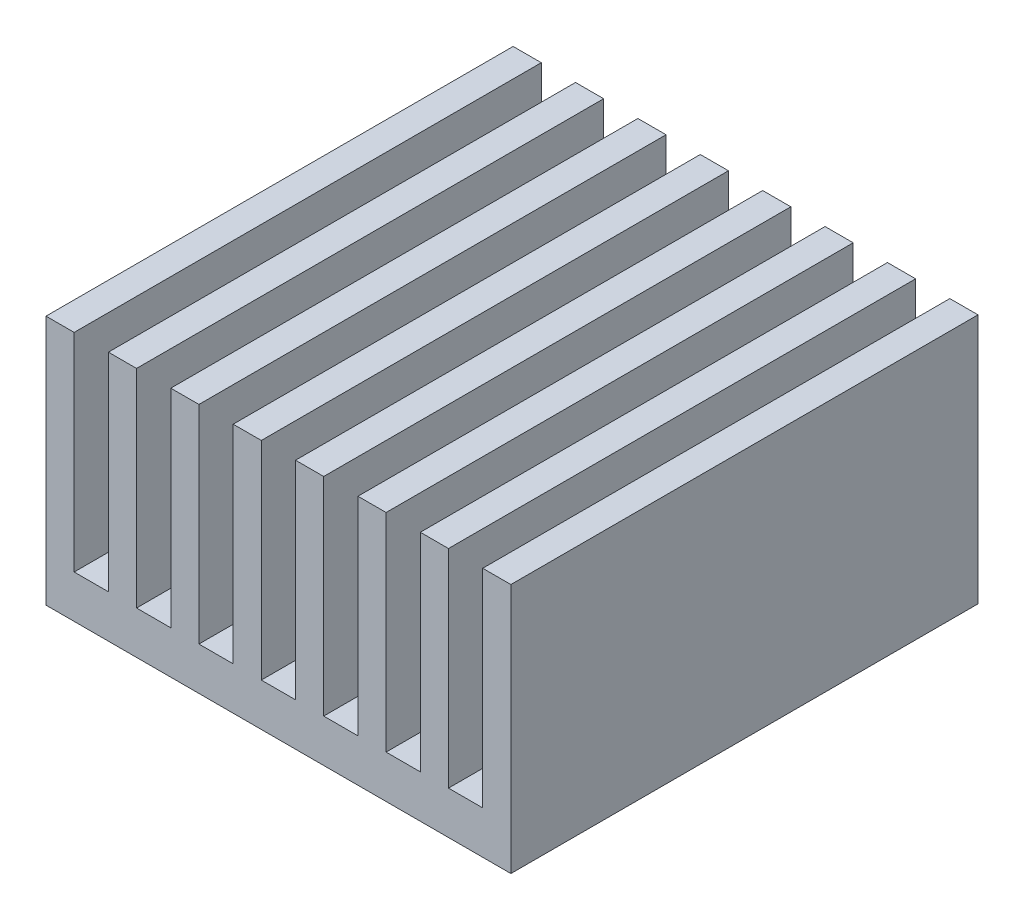
ISO-10303-21;
HEADER;
FILE_DESCRIPTION(('STEP AP214'),'2;1');
FILE_NAME('part.step','',(''),(''),'','','');
FILE_SCHEMA(('AUTOMOTIVE_DESIGN { 1 0 10303 214 1 1 1 1 }'));
ENDSEC;
DATA;
#1=APPLICATION_CONTEXT('core data for automotive mechanical design processes');
#2=APPLICATION_PROTOCOL_DEFINITION('international standard','automotive_design',2000,#1);
#3=PRODUCT_CONTEXT('',#1,'mechanical');
#4=PRODUCT('Part','Part','',(#3));
#5=PRODUCT_RELATED_PRODUCT_CATEGORY('part','',(#4));
#6=PRODUCT_DEFINITION_FORMATION('','',#4);
#7=PRODUCT_DEFINITION_CONTEXT('part definition',#1,'design');
#8=PRODUCT_DEFINITION('design','',#6,#7);
#9=PRODUCT_DEFINITION_SHAPE('','',#8);
#10=(LENGTH_UNIT() NAMED_UNIT(*) SI_UNIT(.MILLI.,.METRE.));
#11=(NAMED_UNIT(*) PLANE_ANGLE_UNIT() SI_UNIT($,.RADIAN.));
#12=(NAMED_UNIT(*) SI_UNIT($,.STERADIAN.) SOLID_ANGLE_UNIT());
#13=UNCERTAINTY_MEASURE_WITH_UNIT(LENGTH_MEASURE(1.E-05),#10,'distance_accuracy_value','');
#14=(GEOMETRIC_REPRESENTATION_CONTEXT(3) GLOBAL_UNCERTAINTY_ASSIGNED_CONTEXT((#13)) GLOBAL_UNIT_ASSIGNED_CONTEXT((#10,
#11,#12)) REPRESENTATION_CONTEXT('',''));
#15=CARTESIAN_POINT('',(0.,0.,0.));
#16=DIRECTION('',(0.,0.,1.));
#17=DIRECTION('',(1.,0.,0.));
#18=AXIS2_PLACEMENT_3D('',#15,#16,#17);
#19=CARTESIAN_POINT('',(0.,1.52,0.));
#20=DIRECTION('',(0.,-1.,0.));
#21=DIRECTION('',(0.,0.,-1.));
#22=AXIS2_PLACEMENT_3D('',#19,#20,#21);
#23=PLANE('',#22);
#24=DIRECTION('',(0.,0.,1.));
#25=VECTOR('',#24,1.);
#26=CARTESIAN_POINT('',(15.51,1.52,-16.59));
#27=LINE('',#26,#25);
#28=CARTESIAN_POINT('',(15.51,1.52,-16.59));
#29=VERTEX_POINT('',#28);
#30=CARTESIAN_POINT('',(15.51,1.52,0.));
#31=VERTEX_POINT('',#30);
#32=EDGE_CURVE('E267',#29,#31,#27,.T.);
#33=ORIENTED_EDGE('',*,*,#32,.F.);
#34=DIRECTION('',(-1.,0.,0.));
#35=VECTOR('',#34,1.);
#36=CARTESIAN_POINT('',(0.,1.52,-16.59));
#37=LINE('',#36,#35);
#38=CARTESIAN_POINT('',(14.2942857142857,1.52,-16.59));
#39=VERTEX_POINT('',#38);
#40=EDGE_CURVE('E271',#29,#39,#37,.T.);
#41=ORIENTED_EDGE('',*,*,#40,.T.);
#42=DIRECTION('',(0.,0.,-1.));
#43=VECTOR('',#42,1.);
#44=CARTESIAN_POINT('',(14.2942857142857,1.52,-16.59));
#45=LINE('',#44,#43);
#46=CARTESIAN_POINT('',(14.2942857142857,1.52,0.));
#47=VERTEX_POINT('',#46);
#48=EDGE_CURVE('E59',#47,#39,#45,.T.);
#49=ORIENTED_EDGE('',*,*,#48,.F.);
#50=DIRECTION('',(1.,0.,0.));
#51=VECTOR('',#50,1.);
#52=CARTESIAN_POINT('',(0.,1.52,0.));
#53=LINE('',#52,#51);
#54=EDGE_CURVE('E54',#47,#31,#53,.T.);
#55=ORIENTED_EDGE('',*,*,#54,.T.);
#56=EDGE_LOOP('',(#33,#41,#49,#55));
#57=FACE_BOUND('',#56,.T.);
#58=ADVANCED_FACE('F39',(#57),#23,.F.);
#59=DIRECTION('',(0.,0.,1.));
#60=VECTOR('',#59,1.);
#61=CARTESIAN_POINT('',(13.2942857142857,1.52,-16.59));
#62=LINE('',#61,#60);
#63=CARTESIAN_POINT('',(13.2942857142857,1.52,-16.59));
#64=VERTEX_POINT('',#63);
#65=CARTESIAN_POINT('',(13.2942857142857,1.52,0.));
#66=VERTEX_POINT('',#65);
#67=EDGE_CURVE('E272',#64,#66,#62,.T.);
#68=ORIENTED_EDGE('',*,*,#67,.F.);
#69=CARTESIAN_POINT('',(12.0785714285714,1.52,-16.59));
#70=VERTEX_POINT('',#69);
#71=EDGE_CURVE('E461',#64,#70,#37,.T.);
#72=ORIENTED_EDGE('',*,*,#71,.T.);
#73=DIRECTION('',(0.,0.,-1.));
#74=VECTOR('',#73,1.);
#75=CARTESIAN_POINT('',(12.0785714285714,1.52,-16.59));
#76=LINE('',#75,#74);
#77=CARTESIAN_POINT('',(12.0785714285714,1.52,0.));
#78=VERTEX_POINT('',#77);
#79=EDGE_CURVE('E305',#78,#70,#76,.T.);
#80=ORIENTED_EDGE('',*,*,#79,.F.);
#81=EDGE_CURVE('E527',#78,#66,#53,.T.);
#82=ORIENTED_EDGE('',*,*,#81,.T.);
#83=EDGE_LOOP('',(#68,#72,#80,#82));
#84=FACE_BOUND('',#83,.T.);
#85=ADVANCED_FACE('F534',(#84),#23,.F.);
#86=DIRECTION('',(0.,0.,1.));
#87=VECTOR('',#86,1.);
#88=CARTESIAN_POINT('',(11.0785714285714,1.52,-16.59));
#89=LINE('',#88,#87);
#90=CARTESIAN_POINT('',(11.0785714285714,1.52,-16.59));
#91=VERTEX_POINT('',#90);
#92=CARTESIAN_POINT('',(11.0785714285714,1.52,0.));
#93=VERTEX_POINT('',#92);
#94=EDGE_CURVE('E300',#91,#93,#89,.T.);
#95=ORIENTED_EDGE('',*,*,#94,.F.);
#96=CARTESIAN_POINT('',(9.86285714285715,1.52,-16.59));
#97=VERTEX_POINT('',#96);
#98=EDGE_CURVE('E549',#91,#97,#37,.T.);
#99=ORIENTED_EDGE('',*,*,#98,.T.);
#100=DIRECTION('',(0.,0.,-1.));
#101=VECTOR('',#100,1.);
#102=CARTESIAN_POINT('',(9.86285714285714,1.52,-16.59));
#103=LINE('',#102,#101);
#104=CARTESIAN_POINT('',(9.86285714285715,1.52,0.));
#105=VERTEX_POINT('',#104);
#106=EDGE_CURVE('E332',#105,#97,#103,.T.);
#107=ORIENTED_EDGE('',*,*,#106,.F.);
#108=EDGE_CURVE('E523',#105,#93,#53,.T.);
#109=ORIENTED_EDGE('',*,*,#108,.T.);
#110=EDGE_LOOP('',(#95,#99,#107,#109));
#111=FACE_BOUND('',#110,.T.);
#112=ADVANCED_FACE('F589',(#111),#23,.F.);
#113=DIRECTION('',(0.,0.,1.));
#114=VECTOR('',#113,1.);
#115=CARTESIAN_POINT('',(8.86285714285714,1.52,-16.59));
#116=LINE('',#115,#114);
#117=CARTESIAN_POINT('',(8.86285714285714,1.52,-16.59));
#118=VERTEX_POINT('',#117);
#119=CARTESIAN_POINT('',(8.86285714285714,1.52,0.));
#120=VERTEX_POINT('',#119);
#121=EDGE_CURVE('E327',#118,#120,#116,.T.);
#122=ORIENTED_EDGE('',*,*,#121,.F.);
#123=CARTESIAN_POINT('',(7.64714285714286,1.52,-16.59));
#124=VERTEX_POINT('',#123);
#125=EDGE_CURVE('E550',#118,#124,#37,.T.);
#126=ORIENTED_EDGE('',*,*,#125,.T.);
#127=DIRECTION('',(0.,0.,-1.));
#128=VECTOR('',#127,1.);
#129=CARTESIAN_POINT('',(7.64714285714286,1.52,-16.59));
#130=LINE('',#129,#128);
#131=CARTESIAN_POINT('',(7.64714285714286,1.52,0.));
#132=VERTEX_POINT('',#131);
#133=EDGE_CURVE('E359',#132,#124,#130,.T.);
#134=ORIENTED_EDGE('',*,*,#133,.F.);
#135=EDGE_CURVE('E519',#132,#120,#53,.T.);
#136=ORIENTED_EDGE('',*,*,#135,.T.);
#137=EDGE_LOOP('',(#122,#126,#134,#136));
#138=FACE_BOUND('',#137,.T.);
#139=ADVANCED_FACE('F575',(#138),#23,.F.);
#140=DIRECTION('',(0.,0.,1.));
#141=VECTOR('',#140,1.);
#142=CARTESIAN_POINT('',(6.64714285714286,1.52,-16.59));
#143=LINE('',#142,#141);
#144=CARTESIAN_POINT('',(6.64714285714286,1.52,-16.59));
#145=VERTEX_POINT('',#144);
#146=CARTESIAN_POINT('',(6.64714285714286,1.52,0.));
#147=VERTEX_POINT('',#146);
#148=EDGE_CURVE('E354',#145,#147,#143,.T.);
#149=ORIENTED_EDGE('',*,*,#148,.F.);
#150=CARTESIAN_POINT('',(5.43142857142857,1.52,-16.59));
#151=VERTEX_POINT('',#150);
#152=EDGE_CURVE('E551',#145,#151,#37,.T.);
#153=ORIENTED_EDGE('',*,*,#152,.T.);
#154=DIRECTION('',(0.,0.,-1.));
#155=VECTOR('',#154,1.);
#156=CARTESIAN_POINT('',(5.43142857142857,1.52,-16.59));
#157=LINE('',#156,#155);
#158=CARTESIAN_POINT('',(5.43142857142857,1.52,0.));
#159=VERTEX_POINT('',#158);
#160=EDGE_CURVE('E386',#159,#151,#157,.T.);
#161=ORIENTED_EDGE('',*,*,#160,.F.);
#162=EDGE_CURVE('E518',#159,#147,#53,.T.);
#163=ORIENTED_EDGE('',*,*,#162,.T.);
#164=EDGE_LOOP('',(#149,#153,#161,#163));
#165=FACE_BOUND('',#164,.T.);
#166=ADVANCED_FACE('F552',(#165),#23,.F.);
#167=DIRECTION('',(0.,0.,1.));
#168=VECTOR('',#167,1.);
#169=CARTESIAN_POINT('',(4.43142857142857,1.52,-16.59));
#170=LINE('',#169,#168);
#171=CARTESIAN_POINT('',(4.43142857142857,1.52,-16.59));
#172=VERTEX_POINT('',#171);
#173=CARTESIAN_POINT('',(4.43142857142857,1.52,0.));
#174=VERTEX_POINT('',#173);
#175=EDGE_CURVE('E381',#172,#174,#170,.T.);
#176=ORIENTED_EDGE('',*,*,#175,.F.);
#177=CARTESIAN_POINT('',(3.21571428571429,1.52,-16.59));
#178=VERTEX_POINT('',#177);
#179=EDGE_CURVE('E515',#172,#178,#37,.T.);
#180=ORIENTED_EDGE('',*,*,#179,.T.);
#181=DIRECTION('',(0.,0.,-1.));
#182=VECTOR('',#181,1.);
#183=CARTESIAN_POINT('',(3.21571428571429,1.52,-16.59));
#184=LINE('',#183,#182);
#185=CARTESIAN_POINT('',(3.21571428571429,1.52,0.));
#186=VERTEX_POINT('',#185);
#187=EDGE_CURVE('E413',#186,#178,#184,.T.);
#188=ORIENTED_EDGE('',*,*,#187,.F.);
#189=EDGE_CURVE('E458',#186,#174,#53,.T.);
#190=ORIENTED_EDGE('',*,*,#189,.T.);
#191=EDGE_LOOP('',(#176,#180,#188,#190));
#192=FACE_BOUND('',#191,.T.);
#193=ADVANCED_FACE('F514',(#192),#23,.F.);
#194=DIRECTION('',(0.,0.,1.));
#195=VECTOR('',#194,1.);
#196=CARTESIAN_POINT('',(2.21571428571428,1.52,-16.59));
#197=LINE('',#196,#195);
#198=CARTESIAN_POINT('',(2.21571428571428,1.52,-16.59));
#199=VERTEX_POINT('',#198);
#200=CARTESIAN_POINT('',(2.21571428571428,1.52,0.));
#201=VERTEX_POINT('',#200);
#202=EDGE_CURVE('E408',#199,#201,#197,.T.);
#203=ORIENTED_EDGE('',*,*,#202,.F.);
#204=CARTESIAN_POINT('',(1.,1.52,-16.59));
#205=VERTEX_POINT('',#204);
#206=EDGE_CURVE('E457',#199,#205,#37,.T.);
#207=ORIENTED_EDGE('',*,*,#206,.T.);
#208=DIRECTION('',(0.,0.,-1.));
#209=VECTOR('',#208,1.);
#210=CARTESIAN_POINT('',(1.,1.52,-16.59));
#211=LINE('',#210,#209);
#212=CARTESIAN_POINT('',(1.,1.52,0.));
#213=VERTEX_POINT('',#212);
#214=EDGE_CURVE('E435',#213,#205,#211,.T.);
#215=ORIENTED_EDGE('',*,*,#214,.F.);
#216=EDGE_CURVE('E455',#213,#201,#53,.T.);
#217=ORIENTED_EDGE('',*,*,#216,.T.);
#218=EDGE_LOOP('',(#203,#207,#215,#217));
#219=FACE_BOUND('',#218,.T.);
#220=ADVANCED_FACE('F497',(#219),#23,.F.);
#221=CARTESIAN_POINT('',(0.,1.52,0.));
#222=DIRECTION('',(1.,0.,0.));
#223=DIRECTION('',(0.,0.,-1.));
#224=AXIS2_PLACEMENT_3D('',#221,#222,#223);
#225=PLANE('',#224);
#226=DIRECTION('',(0.,0.,1.));
#227=VECTOR('',#226,1.);
#228=CARTESIAN_POINT('',(0.,0.,0.));
#229=LINE('',#228,#227);
#230=CARTESIAN_POINT('',(0.,0.,-16.59));
#231=VERTEX_POINT('',#230);
#232=CARTESIAN_POINT('',(0.,0.,0.));
#233=VERTEX_POINT('',#232);
#234=EDGE_CURVE('E454',#231,#233,#229,.T.);
#235=ORIENTED_EDGE('',*,*,#234,.T.);
#236=DIRECTION('',(0.,-1.,0.));
#237=VECTOR('',#236,1.);
#238=CARTESIAN_POINT('',(0.,1.52,0.));
#239=LINE('',#238,#237);
#240=CARTESIAN_POINT('',(0.,8.89,0.));
#241=VERTEX_POINT('',#240);
#242=EDGE_CURVE('E11',#241,#233,#239,.T.);
#243=ORIENTED_EDGE('',*,*,#242,.F.);
#244=DIRECTION('',(0.,0.,1.));
#245=VECTOR('',#244,1.);
#246=CARTESIAN_POINT('',(0.,8.89,-16.59));
#247=LINE('',#246,#245);
#248=CARTESIAN_POINT('',(0.,8.89,-16.59));
#249=VERTEX_POINT('',#248);
#250=EDGE_CURVE('E436',#249,#241,#247,.T.);
#251=ORIENTED_EDGE('',*,*,#250,.F.);
#252=DIRECTION('',(0.,-1.,0.));
#253=VECTOR('',#252,1.);
#254=CARTESIAN_POINT('',(0.,1.52,-16.59));
#255=LINE('',#254,#253);
#256=EDGE_CURVE('E460',#249,#231,#255,.T.);
#257=ORIENTED_EDGE('',*,*,#256,.T.);
#258=EDGE_LOOP('',(#235,#243,#251,#257));
#259=FACE_BOUND('',#258,.T.);
#260=ADVANCED_FACE('F41',(#259),#225,.F.);
#261=CARTESIAN_POINT('',(0.,1.52,0.));
#262=DIRECTION('',(0.,0.,-1.));
#263=DIRECTION('',(-1.,0.,0.));
#264=AXIS2_PLACEMENT_3D('',#261,#262,#263);
#265=PLANE('',#264);
#266=DIRECTION('',(1.,0.,0.));
#267=VECTOR('',#266,1.);
#268=CARTESIAN_POINT('',(0.,0.,0.));
#269=LINE('',#268,#267);
#270=CARTESIAN_POINT('',(16.51,0.,0.));
#271=VERTEX_POINT('',#270);
#272=EDGE_CURVE('E464',#233,#271,#269,.T.);
#273=ORIENTED_EDGE('',*,*,#272,.T.);
#274=DIRECTION('',(0.,-1.,0.));
#275=VECTOR('',#274,1.);
#276=CARTESIAN_POINT('',(16.51,1.52,0.));
#277=LINE('',#276,#275);
#278=CARTESIAN_POINT('',(16.51,8.89,0.));
#279=VERTEX_POINT('',#278);
#280=EDGE_CURVE('E47',#279,#271,#277,.T.);
#281=ORIENTED_EDGE('',*,*,#280,.F.);
#282=DIRECTION('',(1.,0.,0.));
#283=VECTOR('',#282,1.);
#284=CARTESIAN_POINT('',(15.51,8.89,0.));
#285=LINE('',#284,#283);
#286=CARTESIAN_POINT('',(15.51,8.89,0.));
#287=VERTEX_POINT('',#286);
#288=EDGE_CURVE('E257',#287,#279,#285,.T.);
#289=ORIENTED_EDGE('',*,*,#288,.F.);
#290=DIRECTION('',(0.,-1.,0.));
#291=VECTOR('',#290,1.);
#292=CARTESIAN_POINT('',(15.51,8.89,0.));
#293=LINE('',#292,#291);
#294=EDGE_CURVE('E253',#287,#31,#293,.T.);
#295=ORIENTED_EDGE('',*,*,#294,.T.);
#296=ORIENTED_EDGE('',*,*,#54,.F.);
#297=DIRECTION('',(0.,-1.,0.));
#298=VECTOR('',#297,1.);
#299=CARTESIAN_POINT('',(14.2942857142857,8.89,0.));
#300=LINE('',#299,#298);
#301=CARTESIAN_POINT('',(14.2942857142857,8.89,0.));
#302=VERTEX_POINT('',#301);
#303=EDGE_CURVE('E291',#302,#47,#300,.T.);
#304=ORIENTED_EDGE('',*,*,#303,.F.);
#305=DIRECTION('',(1.,0.,0.));
#306=VECTOR('',#305,1.);
#307=CARTESIAN_POINT('',(13.2942857142857,8.89,0.));
#308=LINE('',#307,#306);
#309=CARTESIAN_POINT('',(13.2942857142857,8.89,0.));
#310=VERTEX_POINT('',#309);
#311=EDGE_CURVE('E284',#310,#302,#308,.T.);
#312=ORIENTED_EDGE('',*,*,#311,.F.);
#313=DIRECTION('',(0.,-1.,0.));
#314=VECTOR('',#313,1.);
#315=CARTESIAN_POINT('',(13.2942857142857,8.89,0.));
#316=LINE('',#315,#314);
#317=EDGE_CURVE('E294',#310,#66,#316,.T.);
#318=ORIENTED_EDGE('',*,*,#317,.T.);
#319=ORIENTED_EDGE('',*,*,#81,.F.);
#320=DIRECTION('',(0.,-1.,0.));
#321=VECTOR('',#320,1.);
#322=CARTESIAN_POINT('',(12.0785714285714,8.89,0.));
#323=LINE('',#322,#321);
#324=CARTESIAN_POINT('',(12.0785714285714,8.89,0.));
#325=VERTEX_POINT('',#324);
#326=EDGE_CURVE('E318',#325,#78,#323,.T.);
#327=ORIENTED_EDGE('',*,*,#326,.F.);
#328=DIRECTION('',(1.,0.,0.));
#329=VECTOR('',#328,1.);
#330=CARTESIAN_POINT('',(11.0785714285714,8.89,0.));
#331=LINE('',#330,#329);
#332=CARTESIAN_POINT('',(11.0785714285714,8.89,0.));
#333=VERTEX_POINT('',#332);
#334=EDGE_CURVE('E307',#333,#325,#331,.T.);
#335=ORIENTED_EDGE('',*,*,#334,.F.);
#336=DIRECTION('',(0.,-1.,0.));
#337=VECTOR('',#336,1.);
#338=CARTESIAN_POINT('',(11.0785714285714,8.89,0.));
#339=LINE('',#338,#337);
#340=EDGE_CURVE('E321',#333,#93,#339,.T.);
#341=ORIENTED_EDGE('',*,*,#340,.T.);
#342=ORIENTED_EDGE('',*,*,#108,.F.);
#343=DIRECTION('',(0.,-1.,0.));
#344=VECTOR('',#343,1.);
#345=CARTESIAN_POINT('',(9.86285714285715,8.89,0.));
#346=LINE('',#345,#344);
#347=CARTESIAN_POINT('',(9.86285714285715,8.89,0.));
#348=VERTEX_POINT('',#347);
#349=EDGE_CURVE('E345',#348,#105,#346,.T.);
#350=ORIENTED_EDGE('',*,*,#349,.F.);
#351=DIRECTION('',(1.,0.,0.));
#352=VECTOR('',#351,1.);
#353=CARTESIAN_POINT('',(8.86285714285715,8.89,0.));
#354=LINE('',#353,#352);
#355=CARTESIAN_POINT('',(8.86285714285715,8.89,0.));
#356=VERTEX_POINT('',#355);
#357=EDGE_CURVE('E334',#356,#348,#354,.T.);
#358=ORIENTED_EDGE('',*,*,#357,.F.);
#359=DIRECTION('',(0.,-1.,0.));
#360=VECTOR('',#359,1.);
#361=CARTESIAN_POINT('',(8.86285714285715,8.89,0.));
#362=LINE('',#361,#360);
#363=EDGE_CURVE('E348',#356,#120,#362,.T.);
#364=ORIENTED_EDGE('',*,*,#363,.T.);
#365=ORIENTED_EDGE('',*,*,#135,.F.);
#366=DIRECTION('',(0.,-1.,0.));
#367=VECTOR('',#366,1.);
#368=CARTESIAN_POINT('',(7.64714285714286,8.89,0.));
#369=LINE('',#368,#367);
#370=CARTESIAN_POINT('',(7.64714285714286,8.89,0.));
#371=VERTEX_POINT('',#370);
#372=EDGE_CURVE('E372',#371,#132,#369,.T.);
#373=ORIENTED_EDGE('',*,*,#372,.F.);
#374=DIRECTION('',(1.,0.,0.));
#375=VECTOR('',#374,1.);
#376=CARTESIAN_POINT('',(6.64714285714286,8.89,0.));
#377=LINE('',#376,#375);
#378=CARTESIAN_POINT('',(6.64714285714286,8.89,0.));
#379=VERTEX_POINT('',#378);
#380=EDGE_CURVE('E361',#379,#371,#377,.T.);
#381=ORIENTED_EDGE('',*,*,#380,.F.);
#382=DIRECTION('',(0.,-1.,0.));
#383=VECTOR('',#382,1.);
#384=CARTESIAN_POINT('',(6.64714285714286,8.89,0.));
#385=LINE('',#384,#383);
#386=EDGE_CURVE('E375',#379,#147,#385,.T.);
#387=ORIENTED_EDGE('',*,*,#386,.T.);
#388=ORIENTED_EDGE('',*,*,#162,.F.);
#389=DIRECTION('',(0.,-1.,0.));
#390=VECTOR('',#389,1.);
#391=CARTESIAN_POINT('',(5.43142857142857,8.89,0.));
#392=LINE('',#391,#390);
#393=CARTESIAN_POINT('',(5.43142857142857,8.89,0.));
#394=VERTEX_POINT('',#393);
#395=EDGE_CURVE('E399',#394,#159,#392,.T.);
#396=ORIENTED_EDGE('',*,*,#395,.F.);
#397=DIRECTION('',(1.,0.,0.));
#398=VECTOR('',#397,1.);
#399=CARTESIAN_POINT('',(4.43142857142857,8.89,0.));
#400=LINE('',#399,#398);
#401=CARTESIAN_POINT('',(4.43142857142857,8.89,0.));
#402=VERTEX_POINT('',#401);
#403=EDGE_CURVE('E388',#402,#394,#400,.T.);
#404=ORIENTED_EDGE('',*,*,#403,.F.);
#405=DIRECTION('',(0.,-1.,0.));
#406=VECTOR('',#405,1.);
#407=CARTESIAN_POINT('',(4.43142857142857,8.89,0.));
#408=LINE('',#407,#406);
#409=EDGE_CURVE('E402',#402,#174,#408,.T.);
#410=ORIENTED_EDGE('',*,*,#409,.T.);
#411=ORIENTED_EDGE('',*,*,#189,.F.);
#412=DIRECTION('',(0.,-1.,0.));
#413=VECTOR('',#412,1.);
#414=CARTESIAN_POINT('',(3.21571428571429,8.89,0.));
#415=LINE('',#414,#413);
#416=CARTESIAN_POINT('',(3.21571428571429,8.89,0.));
#417=VERTEX_POINT('',#416);
#418=EDGE_CURVE('E426',#417,#186,#415,.T.);
#419=ORIENTED_EDGE('',*,*,#418,.F.);
#420=DIRECTION('',(1.,0.,0.));
#421=VECTOR('',#420,1.);
#422=CARTESIAN_POINT('',(2.21571428571429,8.89,0.));
#423=LINE('',#422,#421);
#424=CARTESIAN_POINT('',(2.21571428571429,8.89,0.));
#425=VERTEX_POINT('',#424);
#426=EDGE_CURVE('E415',#425,#417,#423,.T.);
#427=ORIENTED_EDGE('',*,*,#426,.F.);
#428=DIRECTION('',(0.,-1.,0.));
#429=VECTOR('',#428,1.);
#430=CARTESIAN_POINT('',(2.21571428571429,8.89,0.));
#431=LINE('',#430,#429);
#432=EDGE_CURVE('E429',#425,#201,#431,.T.);
#433=ORIENTED_EDGE('',*,*,#432,.T.);
#434=ORIENTED_EDGE('',*,*,#216,.F.);
#435=DIRECTION('',(0.,-1.,0.));
#436=VECTOR('',#435,1.);
#437=CARTESIAN_POINT('',(1.,8.89,0.));
#438=LINE('',#437,#436);
#439=CARTESIAN_POINT('',(1.,8.89,0.));
#440=VERTEX_POINT('',#439);
#441=EDGE_CURVE('E451',#440,#213,#438,.T.);
#442=ORIENTED_EDGE('',*,*,#441,.F.);
#443=DIRECTION('',(1.,0.,0.));
#444=VECTOR('',#443,1.);
#445=CARTESIAN_POINT('',(0.,8.89,0.));
#446=LINE('',#445,#444);
#447=EDGE_CURVE('E439',#241,#440,#446,.T.);
#448=ORIENTED_EDGE('',*,*,#447,.F.);
#449=ORIENTED_EDGE('',*,*,#242,.T.);
#450=EDGE_LOOP('',(#273,#281,#289,#295,#296,#304,#312,#318,#319,#327,#335,#341,#342,#350,#358,
#364,#365,#373,#381,#387,#388,#396,#404,#410,#411,#419,#427,#433,#434,#442,#448,#449));
#451=FACE_BOUND('',#450,.T.);
#452=ADVANCED_FACE('F498',(#451),#265,.F.);
#453=CARTESIAN_POINT('',(16.51,1.52,0.));
#454=DIRECTION('',(-1.,0.,0.));
#455=DIRECTION('',(0.,0.,1.));
#456=AXIS2_PLACEMENT_3D('',#453,#454,#455);
#457=PLANE('',#456);
#458=DIRECTION('',(0.,0.,-1.));
#459=VECTOR('',#458,1.);
#460=CARTESIAN_POINT('',(16.51,0.,0.));
#461=LINE('',#460,#459);
#462=CARTESIAN_POINT('',(16.51,0.,-16.59));
#463=VERTEX_POINT('',#462);
#464=EDGE_CURVE('E466',#271,#463,#461,.T.);
#465=ORIENTED_EDGE('',*,*,#464,.T.);
#466=DIRECTION('',(0.,-1.,0.));
#467=VECTOR('',#466,1.);
#468=CARTESIAN_POINT('',(16.51,1.52,-16.59));
#469=LINE('',#468,#467);
#470=CARTESIAN_POINT('',(16.51,8.89,-16.59));
#471=VERTEX_POINT('',#470);
#472=EDGE_CURVE('E472',#471,#463,#469,.T.);
#473=ORIENTED_EDGE('',*,*,#472,.F.);
#474=DIRECTION('',(0.,0.,-1.));
#475=VECTOR('',#474,1.);
#476=CARTESIAN_POINT('',(16.51,8.89,-16.59));
#477=LINE('',#476,#475);
#478=EDGE_CURVE('E264',#279,#471,#477,.T.);
#479=ORIENTED_EDGE('',*,*,#478,.F.);
#480=ORIENTED_EDGE('',*,*,#280,.T.);
#481=EDGE_LOOP('',(#465,#473,#479,#480));
#482=FACE_BOUND('',#481,.T.);
#483=ADVANCED_FACE('F476',(#482),#457,.F.);
#484=CARTESIAN_POINT('',(0.,1.52,-16.59));
#485=DIRECTION('',(0.,0.,1.));
#486=DIRECTION('',(1.,0.,0.));
#487=AXIS2_PLACEMENT_3D('',#484,#485,#486);
#488=PLANE('',#487);
#489=DIRECTION('',(-1.,0.,0.));
#490=VECTOR('',#489,1.);
#491=CARTESIAN_POINT('',(0.,0.,-16.59));
#492=LINE('',#491,#490);
#493=EDGE_CURVE('E468',#463,#231,#492,.T.);
#494=ORIENTED_EDGE('',*,*,#493,.T.);
#495=ORIENTED_EDGE('',*,*,#256,.F.);
#496=DIRECTION('',(-1.,0.,0.));
#497=VECTOR('',#496,1.);
#498=CARTESIAN_POINT('',(0.,8.89,-16.59));
#499=LINE('',#498,#497);
#500=CARTESIAN_POINT('',(1.,8.89,-16.59));
#501=VERTEX_POINT('',#500);
#502=EDGE_CURVE('E443',#501,#249,#499,.T.);
#503=ORIENTED_EDGE('',*,*,#502,.F.);
#504=DIRECTION('',(0.,-1.,0.));
#505=VECTOR('',#504,1.);
#506=CARTESIAN_POINT('',(1.,8.89,-16.59));
#507=LINE('',#506,#505);
#508=EDGE_CURVE('E446',#501,#205,#507,.T.);
#509=ORIENTED_EDGE('',*,*,#508,.T.);
#510=ORIENTED_EDGE('',*,*,#206,.F.);
#511=DIRECTION('',(0.,-1.,0.));
#512=VECTOR('',#511,1.);
#513=CARTESIAN_POINT('',(2.21571428571428,8.89,-16.59));
#514=LINE('',#513,#512);
#515=CARTESIAN_POINT('',(2.21571428571428,8.89,-16.59));
#516=VERTEX_POINT('',#515);
#517=EDGE_CURVE('E432',#516,#199,#514,.T.);
#518=ORIENTED_EDGE('',*,*,#517,.F.);
#519=DIRECTION('',(-1.,0.,0.));
#520=VECTOR('',#519,1.);
#521=CARTESIAN_POINT('',(2.21571428571428,8.89,-16.59));
#522=LINE('',#521,#520);
#523=CARTESIAN_POINT('',(3.21571428571429,8.89,-16.59));
#524=VERTEX_POINT('',#523);
#525=EDGE_CURVE('E409',#524,#516,#522,.T.);
#526=ORIENTED_EDGE('',*,*,#525,.F.);
#527=DIRECTION('',(0.,-1.,0.));
#528=VECTOR('',#527,1.);
#529=CARTESIAN_POINT('',(3.21571428571429,8.89,-16.59));
#530=LINE('',#529,#528);
#531=EDGE_CURVE('E419',#524,#178,#530,.T.);
#532=ORIENTED_EDGE('',*,*,#531,.T.);
#533=ORIENTED_EDGE('',*,*,#179,.F.);
#534=DIRECTION('',(0.,-1.,0.));
#535=VECTOR('',#534,1.);
#536=CARTESIAN_POINT('',(4.43142857142857,8.89,-16.59));
#537=LINE('',#536,#535);
#538=CARTESIAN_POINT('',(4.43142857142857,8.89,-16.59));
#539=VERTEX_POINT('',#538);
#540=EDGE_CURVE('E405',#539,#172,#537,.T.);
#541=ORIENTED_EDGE('',*,*,#540,.F.);
#542=DIRECTION('',(-1.,0.,0.));
#543=VECTOR('',#542,1.);
#544=CARTESIAN_POINT('',(4.43142857142857,8.89,-16.59));
#545=LINE('',#544,#543);
#546=CARTESIAN_POINT('',(5.43142857142857,8.89,-16.59));
#547=VERTEX_POINT('',#546);
#548=EDGE_CURVE('E382',#547,#539,#545,.T.);
#549=ORIENTED_EDGE('',*,*,#548,.F.);
#550=DIRECTION('',(0.,-1.,0.));
#551=VECTOR('',#550,1.);
#552=CARTESIAN_POINT('',(5.43142857142857,8.89,-16.59));
#553=LINE('',#552,#551);
#554=EDGE_CURVE('E392',#547,#151,#553,.T.);
#555=ORIENTED_EDGE('',*,*,#554,.T.);
#556=ORIENTED_EDGE('',*,*,#152,.F.);
#557=DIRECTION('',(0.,-1.,0.));
#558=VECTOR('',#557,1.);
#559=CARTESIAN_POINT('',(6.64714285714286,8.89,-16.59));
#560=LINE('',#559,#558);
#561=CARTESIAN_POINT('',(6.64714285714286,8.89,-16.59));
#562=VERTEX_POINT('',#561);
#563=EDGE_CURVE('E378',#562,#145,#560,.T.);
#564=ORIENTED_EDGE('',*,*,#563,.F.);
#565=DIRECTION('',(-1.,0.,0.));
#566=VECTOR('',#565,1.);
#567=CARTESIAN_POINT('',(6.64714285714286,8.89,-16.59));
#568=LINE('',#567,#566);
#569=CARTESIAN_POINT('',(7.64714285714286,8.89,-16.59));
#570=VERTEX_POINT('',#569);
#571=EDGE_CURVE('E355',#570,#562,#568,.T.);
#572=ORIENTED_EDGE('',*,*,#571,.F.);
#573=DIRECTION('',(0.,-1.,0.));
#574=VECTOR('',#573,1.);
#575=CARTESIAN_POINT('',(7.64714285714286,8.89,-16.59));
#576=LINE('',#575,#574);
#577=EDGE_CURVE('E365',#570,#124,#576,.T.);
#578=ORIENTED_EDGE('',*,*,#577,.T.);
#579=ORIENTED_EDGE('',*,*,#125,.F.);
#580=DIRECTION('',(0.,-1.,0.));
#581=VECTOR('',#580,1.);
#582=CARTESIAN_POINT('',(8.86285714285714,8.89,-16.59));
#583=LINE('',#582,#581);
#584=CARTESIAN_POINT('',(8.86285714285714,8.89,-16.59));
#585=VERTEX_POINT('',#584);
#586=EDGE_CURVE('E351',#585,#118,#583,.T.);
#587=ORIENTED_EDGE('',*,*,#586,.F.);
#588=DIRECTION('',(-1.,0.,0.));
#589=VECTOR('',#588,1.);
#590=CARTESIAN_POINT('',(8.86285714285714,8.89,-16.59));
#591=LINE('',#590,#589);
#592=CARTESIAN_POINT('',(9.86285714285714,8.89,-16.59));
#593=VERTEX_POINT('',#592);
#594=EDGE_CURVE('E328',#593,#585,#591,.T.);
#595=ORIENTED_EDGE('',*,*,#594,.F.);
#596=DIRECTION('',(0.,-1.,0.));
#597=VECTOR('',#596,1.);
#598=CARTESIAN_POINT('',(9.86285714285714,8.89,-16.59));
#599=LINE('',#598,#597);
#600=EDGE_CURVE('E338',#593,#97,#599,.T.);
#601=ORIENTED_EDGE('',*,*,#600,.T.);
#602=ORIENTED_EDGE('',*,*,#98,.F.);
#603=DIRECTION('',(0.,-1.,0.));
#604=VECTOR('',#603,1.);
#605=CARTESIAN_POINT('',(11.0785714285714,8.89,-16.59));
#606=LINE('',#605,#604);
#607=CARTESIAN_POINT('',(11.0785714285714,8.89,-16.59));
#608=VERTEX_POINT('',#607);
#609=EDGE_CURVE('E324',#608,#91,#606,.T.);
#610=ORIENTED_EDGE('',*,*,#609,.F.);
#611=DIRECTION('',(-1.,0.,0.));
#612=VECTOR('',#611,1.);
#613=CARTESIAN_POINT('',(11.0785714285714,8.89,-16.59));
#614=LINE('',#613,#612);
#615=CARTESIAN_POINT('',(12.0785714285714,8.89,-16.59));
#616=VERTEX_POINT('',#615);
#617=EDGE_CURVE('E301',#616,#608,#614,.T.);
#618=ORIENTED_EDGE('',*,*,#617,.F.);
#619=DIRECTION('',(0.,-1.,0.));
#620=VECTOR('',#619,1.);
#621=CARTESIAN_POINT('',(12.0785714285714,8.89,-16.59));
#622=LINE('',#621,#620);
#623=EDGE_CURVE('E311',#616,#70,#622,.T.);
#624=ORIENTED_EDGE('',*,*,#623,.T.);
#625=ORIENTED_EDGE('',*,*,#71,.F.);
#626=DIRECTION('',(0.,-1.,0.));
#627=VECTOR('',#626,1.);
#628=CARTESIAN_POINT('',(13.2942857142857,8.89,-16.59));
#629=LINE('',#628,#627);
#630=CARTESIAN_POINT('',(13.2942857142857,8.89,-16.59));
#631=VERTEX_POINT('',#630);
#632=EDGE_CURVE('E297',#631,#64,#629,.T.);
#633=ORIENTED_EDGE('',*,*,#632,.F.);
#634=DIRECTION('',(-1.,0.,0.));
#635=VECTOR('',#634,1.);
#636=CARTESIAN_POINT('',(13.2942857142857,8.89,-16.59));
#637=LINE('',#636,#635);
#638=CARTESIAN_POINT('',(14.2942857142857,8.89,-16.59));
#639=VERTEX_POINT('',#638);
#640=EDGE_CURVE('E279',#639,#631,#637,.T.);
#641=ORIENTED_EDGE('',*,*,#640,.F.);
#642=DIRECTION('',(0.,-1.,0.));
#643=VECTOR('',#642,1.);
#644=CARTESIAN_POINT('',(14.2942857142857,8.89,-16.59));
#645=LINE('',#644,#643);
#646=EDGE_CURVE('E287',#639,#39,#645,.T.);
#647=ORIENTED_EDGE('',*,*,#646,.T.);
#648=ORIENTED_EDGE('',*,*,#40,.F.);
#649=DIRECTION('',(0.,-1.,0.));
#650=VECTOR('',#649,1.);
#651=CARTESIAN_POINT('',(15.51,8.89,-16.59));
#652=LINE('',#651,#650);
#653=CARTESIAN_POINT('',(15.51,8.89,-16.59));
#654=VERTEX_POINT('',#653);
#655=EDGE_CURVE('E251',#654,#29,#652,.T.);
#656=ORIENTED_EDGE('',*,*,#655,.F.);
#657=DIRECTION('',(-1.,0.,0.));
#658=VECTOR('',#657,1.);
#659=CARTESIAN_POINT('',(15.51,8.89,-16.59));
#660=LINE('',#659,#658);
#661=EDGE_CURVE('E258',#471,#654,#660,.T.);
#662=ORIENTED_EDGE('',*,*,#661,.F.);
#663=ORIENTED_EDGE('',*,*,#472,.T.);
#664=EDGE_LOOP('',(#494,#495,#503,#509,#510,#518,#526,#532,#533,#541,#549,#555,#556,#564,#572,
#578,#579,#587,#595,#601,#602,#610,#618,#624,#625,#633,#641,#647,#648,#656,#662,#663));
#665=FACE_BOUND('',#664,.T.);
#666=ADVANCED_FACE('F269',(#665),#488,.F.);
#667=CARTESIAN_POINT('',(0.,0.,0.));
#668=DIRECTION('',(0.,-1.,0.));
#669=DIRECTION('',(0.,0.,-1.));
#670=AXIS2_PLACEMENT_3D('',#667,#668,#669);
#671=PLANE('',#670);
#672=ORIENTED_EDGE('',*,*,#234,.F.);
#673=ORIENTED_EDGE('',*,*,#493,.F.);
#674=ORIENTED_EDGE('',*,*,#464,.F.);
#675=ORIENTED_EDGE('',*,*,#272,.F.);
#676=EDGE_LOOP('',(#672,#673,#674,#675));
#677=FACE_BOUND('',#676,.T.);
#678=ADVANCED_FACE('F481',(#677),#671,.T.);
#679=CARTESIAN_POINT('',(1.,8.89,-16.59));
#680=DIRECTION('',(-1.,0.,0.));
#681=DIRECTION('',(0.,0.,1.));
#682=AXIS2_PLACEMENT_3D('',#679,#680,#681);
#683=PLANE('',#682);
#684=ORIENTED_EDGE('',*,*,#214,.T.);
#685=ORIENTED_EDGE('',*,*,#508,.F.);
#686=DIRECTION('',(0.,0.,-1.));
#687=VECTOR('',#686,1.);
#688=CARTESIAN_POINT('',(1.,8.89,-16.59));
#689=LINE('',#688,#687);
#690=EDGE_CURVE('E441',#440,#501,#689,.T.);
#691=ORIENTED_EDGE('',*,*,#690,.F.);
#692=ORIENTED_EDGE('',*,*,#441,.T.);
#693=EDGE_LOOP('',(#684,#685,#691,#692));
#694=FACE_BOUND('',#693,.T.);
#695=ADVANCED_FACE('F494',(#694),#683,.F.);
#696=CARTESIAN_POINT('',(0.,8.89,0.));
#697=DIRECTION('',(0.,1.,0.));
#698=DIRECTION('',(0.,0.,1.));
#699=AXIS2_PLACEMENT_3D('',#696,#697,#698);
#700=PLANE('',#699);
#701=ORIENTED_EDGE('',*,*,#250,.T.);
#702=ORIENTED_EDGE('',*,*,#447,.T.);
#703=ORIENTED_EDGE('',*,*,#690,.T.);
#704=ORIENTED_EDGE('',*,*,#502,.T.);
#705=EDGE_LOOP('',(#701,#702,#703,#704));
#706=FACE_BOUND('',#705,.T.);
#707=ADVANCED_FACE('F487',(#706),#700,.T.);
#708=CARTESIAN_POINT('',(2.21571428571428,8.89,-16.59));
#709=DIRECTION('',(1.,0.,0.));
#710=DIRECTION('',(0.,0.,-1.));
#711=AXIS2_PLACEMENT_3D('',#708,#709,#710);
#712=PLANE('',#711);
#713=ORIENTED_EDGE('',*,*,#202,.T.);
#714=ORIENTED_EDGE('',*,*,#432,.F.);
#715=DIRECTION('',(0.,0.,1.));
#716=VECTOR('',#715,1.);
#717=CARTESIAN_POINT('',(2.21571428571428,8.89,-16.59));
#718=LINE('',#717,#716);
#719=EDGE_CURVE('E412',#516,#425,#718,.T.);
#720=ORIENTED_EDGE('',*,*,#719,.F.);
#721=ORIENTED_EDGE('',*,*,#517,.T.);
#722=EDGE_LOOP('',(#713,#714,#720,#721));
#723=FACE_BOUND('',#722,.T.);
#724=ADVANCED_FACE('F503',(#723),#712,.F.);
#725=CARTESIAN_POINT('',(3.21571428571429,8.89,-16.59));
#726=DIRECTION('',(-1.,0.,0.));
#727=DIRECTION('',(0.,0.,1.));
#728=AXIS2_PLACEMENT_3D('',#725,#726,#727);
#729=PLANE('',#728);
#730=ORIENTED_EDGE('',*,*,#187,.T.);
#731=ORIENTED_EDGE('',*,*,#531,.F.);
#732=DIRECTION('',(0.,0.,-1.));
#733=VECTOR('',#732,1.);
#734=CARTESIAN_POINT('',(3.21571428571429,8.89,-16.59));
#735=LINE('',#734,#733);
#736=EDGE_CURVE('E417',#417,#524,#735,.T.);
#737=ORIENTED_EDGE('',*,*,#736,.F.);
#738=ORIENTED_EDGE('',*,*,#418,.T.);
#739=EDGE_LOOP('',(#730,#731,#737,#738));
#740=FACE_BOUND('',#739,.T.);
#741=ADVANCED_FACE('F510',(#740),#729,.F.);
#742=CARTESIAN_POINT('',(0.,8.89,0.));
#743=DIRECTION('',(0.,-1.,0.));
#744=DIRECTION('',(0.,0.,-1.));
#745=AXIS2_PLACEMENT_3D('',#742,#743,#744);
#746=PLANE('',#745);
#747=ORIENTED_EDGE('',*,*,#525,.T.);
#748=ORIENTED_EDGE('',*,*,#719,.T.);
#749=ORIENTED_EDGE('',*,*,#426,.T.);
#750=ORIENTED_EDGE('',*,*,#736,.T.);
#751=EDGE_LOOP('',(#747,#748,#749,#750));
#752=FACE_BOUND('',#751,.T.);
#753=ADVANCED_FACE('F507',(#752),#746,.F.);
#754=CARTESIAN_POINT('',(4.43142857142857,8.89,-16.59));
#755=DIRECTION('',(1.,0.,0.));
#756=DIRECTION('',(0.,0.,-1.));
#757=AXIS2_PLACEMENT_3D('',#754,#755,#756);
#758=PLANE('',#757);
#759=ORIENTED_EDGE('',*,*,#175,.T.);
#760=ORIENTED_EDGE('',*,*,#409,.F.);
#761=DIRECTION('',(0.,0.,1.));
#762=VECTOR('',#761,1.);
#763=CARTESIAN_POINT('',(4.43142857142857,8.89,-16.59));
#764=LINE('',#763,#762);
#765=EDGE_CURVE('E385',#539,#402,#764,.T.);
#766=ORIENTED_EDGE('',*,*,#765,.F.);
#767=ORIENTED_EDGE('',*,*,#540,.T.);
#768=EDGE_LOOP('',(#759,#760,#766,#767));
#769=FACE_BOUND('',#768,.T.);
#770=ADVANCED_FACE('F684',(#769),#758,.F.);
#771=CARTESIAN_POINT('',(5.43142857142857,8.89,-16.59));
#772=DIRECTION('',(-1.,0.,0.));
#773=DIRECTION('',(0.,0.,1.));
#774=AXIS2_PLACEMENT_3D('',#771,#772,#773);
#775=PLANE('',#774);
#776=ORIENTED_EDGE('',*,*,#160,.T.);
#777=ORIENTED_EDGE('',*,*,#554,.F.);
#778=DIRECTION('',(0.,0.,-1.));
#779=VECTOR('',#778,1.);
#780=CARTESIAN_POINT('',(5.43142857142857,8.89,-16.59));
#781=LINE('',#780,#779);
#782=EDGE_CURVE('E390',#394,#547,#781,.T.);
#783=ORIENTED_EDGE('',*,*,#782,.F.);
#784=ORIENTED_EDGE('',*,*,#395,.T.);
#785=EDGE_LOOP('',(#776,#777,#783,#784));
#786=FACE_BOUND('',#785,.T.);
#787=ADVANCED_FACE('F556',(#786),#775,.F.);
#788=CARTESIAN_POINT('',(0.,8.89,0.));
#789=DIRECTION('',(0.,-1.,0.));
#790=DIRECTION('',(0.,0.,-1.));
#791=AXIS2_PLACEMENT_3D('',#788,#789,#790);
#792=PLANE('',#791);
#793=ORIENTED_EDGE('',*,*,#548,.T.);
#794=ORIENTED_EDGE('',*,*,#765,.T.);
#795=ORIENTED_EDGE('',*,*,#403,.T.);
#796=ORIENTED_EDGE('',*,*,#782,.T.);
#797=EDGE_LOOP('',(#793,#794,#795,#796));
#798=FACE_BOUND('',#797,.T.);
#799=ADVANCED_FACE('F562',(#798),#792,.F.);
#800=CARTESIAN_POINT('',(6.64714285714286,8.89,-16.59));
#801=DIRECTION('',(1.,0.,0.));
#802=DIRECTION('',(0.,0.,-1.));
#803=AXIS2_PLACEMENT_3D('',#800,#801,#802);
#804=PLANE('',#803);
#805=ORIENTED_EDGE('',*,*,#148,.T.);
#806=ORIENTED_EDGE('',*,*,#386,.F.);
#807=DIRECTION('',(0.,0.,1.));
#808=VECTOR('',#807,1.);
#809=CARTESIAN_POINT('',(6.64714285714286,8.89,-16.59));
#810=LINE('',#809,#808);
#811=EDGE_CURVE('E358',#562,#379,#810,.T.);
#812=ORIENTED_EDGE('',*,*,#811,.F.);
#813=ORIENTED_EDGE('',*,*,#563,.T.);
#814=EDGE_LOOP('',(#805,#806,#812,#813));
#815=FACE_BOUND('',#814,.T.);
#816=ADVANCED_FACE('F567',(#815),#804,.F.);
#817=CARTESIAN_POINT('',(7.64714285714286,8.89,-16.59));
#818=DIRECTION('',(-1.,0.,0.));
#819=DIRECTION('',(0.,0.,1.));
#820=AXIS2_PLACEMENT_3D('',#817,#818,#819);
#821=PLANE('',#820);
#822=ORIENTED_EDGE('',*,*,#133,.T.);
#823=ORIENTED_EDGE('',*,*,#577,.F.);
#824=DIRECTION('',(0.,0.,-1.));
#825=VECTOR('',#824,1.);
#826=CARTESIAN_POINT('',(7.64714285714286,8.89,-16.59));
#827=LINE('',#826,#825);
#828=EDGE_CURVE('E363',#371,#570,#827,.T.);
#829=ORIENTED_EDGE('',*,*,#828,.F.);
#830=ORIENTED_EDGE('',*,*,#372,.T.);
#831=EDGE_LOOP('',(#822,#823,#829,#830));
#832=FACE_BOUND('',#831,.T.);
#833=ADVANCED_FACE('F574',(#832),#821,.F.);
#834=CARTESIAN_POINT('',(0.,8.89,0.));
#835=DIRECTION('',(0.,-1.,0.));
#836=DIRECTION('',(0.,0.,-1.));
#837=AXIS2_PLACEMENT_3D('',#834,#835,#836);
#838=PLANE('',#837);
#839=ORIENTED_EDGE('',*,*,#571,.T.);
#840=ORIENTED_EDGE('',*,*,#811,.T.);
#841=ORIENTED_EDGE('',*,*,#380,.T.);
#842=ORIENTED_EDGE('',*,*,#828,.T.);
#843=EDGE_LOOP('',(#839,#840,#841,#842));
#844=FACE_BOUND('',#843,.T.);
#845=ADVANCED_FACE('F571',(#844),#838,.F.);
#846=CARTESIAN_POINT('',(8.86285714285714,8.89,-16.59));
#847=DIRECTION('',(1.,0.,0.));
#848=DIRECTION('',(0.,0.,-1.));
#849=AXIS2_PLACEMENT_3D('',#846,#847,#848);
#850=PLANE('',#849);
#851=ORIENTED_EDGE('',*,*,#121,.T.);
#852=ORIENTED_EDGE('',*,*,#363,.F.);
#853=DIRECTION('',(0.,0.,1.));
#854=VECTOR('',#853,1.);
#855=CARTESIAN_POINT('',(8.86285714285714,8.89,-16.59));
#856=LINE('',#855,#854);
#857=EDGE_CURVE('E331',#585,#356,#856,.T.);
#858=ORIENTED_EDGE('',*,*,#857,.F.);
#859=ORIENTED_EDGE('',*,*,#586,.T.);
#860=EDGE_LOOP('',(#851,#852,#858,#859));
#861=FACE_BOUND('',#860,.T.);
#862=ADVANCED_FACE('F580',(#861),#850,.F.);
#863=CARTESIAN_POINT('',(9.86285714285714,8.89,-16.59));
#864=DIRECTION('',(-1.,0.,0.));
#865=DIRECTION('',(0.,0.,1.));
#866=AXIS2_PLACEMENT_3D('',#863,#864,#865);
#867=PLANE('',#866);
#868=ORIENTED_EDGE('',*,*,#106,.T.);
#869=ORIENTED_EDGE('',*,*,#600,.F.);
#870=DIRECTION('',(0.,0.,-1.));
#871=VECTOR('',#870,1.);
#872=CARTESIAN_POINT('',(9.86285714285714,8.89,-16.59));
#873=LINE('',#872,#871);
#874=EDGE_CURVE('E336',#348,#593,#873,.T.);
#875=ORIENTED_EDGE('',*,*,#874,.F.);
#876=ORIENTED_EDGE('',*,*,#349,.T.);
#877=EDGE_LOOP('',(#868,#869,#875,#876));
#878=FACE_BOUND('',#877,.T.);
#879=ADVANCED_FACE('F588',(#878),#867,.F.);
#880=CARTESIAN_POINT('',(0.,8.89,0.));
#881=DIRECTION('',(0.,-1.,0.));
#882=DIRECTION('',(0.,0.,-1.));
#883=AXIS2_PLACEMENT_3D('',#880,#881,#882);
#884=PLANE('',#883);
#885=ORIENTED_EDGE('',*,*,#594,.T.);
#886=ORIENTED_EDGE('',*,*,#857,.T.);
#887=ORIENTED_EDGE('',*,*,#357,.T.);
#888=ORIENTED_EDGE('',*,*,#874,.T.);
#889=EDGE_LOOP('',(#885,#886,#887,#888));
#890=FACE_BOUND('',#889,.T.);
#891=ADVANCED_FACE('F585',(#890),#884,.F.);
#892=CARTESIAN_POINT('',(11.0785714285714,8.89,-16.59));
#893=DIRECTION('',(1.,0.,0.));
#894=DIRECTION('',(0.,0.,-1.));
#895=AXIS2_PLACEMENT_3D('',#892,#893,#894);
#896=PLANE('',#895);
#897=ORIENTED_EDGE('',*,*,#94,.T.);
#898=ORIENTED_EDGE('',*,*,#340,.F.);
#899=DIRECTION('',(0.,0.,1.));
#900=VECTOR('',#899,1.);
#901=CARTESIAN_POINT('',(11.0785714285714,8.89,-16.59));
#902=LINE('',#901,#900);
#903=EDGE_CURVE('E304',#608,#333,#902,.T.);
#904=ORIENTED_EDGE('',*,*,#903,.F.);
#905=ORIENTED_EDGE('',*,*,#609,.T.);
#906=EDGE_LOOP('',(#897,#898,#904,#905));
#907=FACE_BOUND('',#906,.T.);
#908=ADVANCED_FACE('F593',(#907),#896,.F.);
#909=CARTESIAN_POINT('',(12.0785714285714,8.89,-16.59));
#910=DIRECTION('',(-1.,0.,0.));
#911=DIRECTION('',(0.,0.,1.));
#912=AXIS2_PLACEMENT_3D('',#909,#910,#911);
#913=PLANE('',#912);
#914=ORIENTED_EDGE('',*,*,#79,.T.);
#915=ORIENTED_EDGE('',*,*,#623,.F.);
#916=DIRECTION('',(0.,0.,-1.));
#917=VECTOR('',#916,1.);
#918=CARTESIAN_POINT('',(12.0785714285714,8.89,-16.59));
#919=LINE('',#918,#917);
#920=EDGE_CURVE('E309',#325,#616,#919,.T.);
#921=ORIENTED_EDGE('',*,*,#920,.F.);
#922=ORIENTED_EDGE('',*,*,#326,.T.);
#923=EDGE_LOOP('',(#914,#915,#921,#922));
#924=FACE_BOUND('',#923,.T.);
#925=ADVANCED_FACE('F599',(#924),#913,.F.);
#926=CARTESIAN_POINT('',(0.,8.89,0.));
#927=DIRECTION('',(0.,-1.,0.));
#928=DIRECTION('',(0.,0.,-1.));
#929=AXIS2_PLACEMENT_3D('',#926,#927,#928);
#930=PLANE('',#929);
#931=ORIENTED_EDGE('',*,*,#617,.T.);
#932=ORIENTED_EDGE('',*,*,#903,.T.);
#933=ORIENTED_EDGE('',*,*,#334,.T.);
#934=ORIENTED_EDGE('',*,*,#920,.T.);
#935=EDGE_LOOP('',(#931,#932,#933,#934));
#936=FACE_BOUND('',#935,.T.);
#937=ADVANCED_FACE('F596',(#936),#930,.F.);
#938=CARTESIAN_POINT('',(13.2942857142857,8.89,-16.59));
#939=DIRECTION('',(1.,0.,0.));
#940=DIRECTION('',(0.,0.,-1.));
#941=AXIS2_PLACEMENT_3D('',#938,#939,#940);
#942=PLANE('',#941);
#943=ORIENTED_EDGE('',*,*,#67,.T.);
#944=ORIENTED_EDGE('',*,*,#317,.F.);
#945=DIRECTION('',(0.,0.,1.));
#946=VECTOR('',#945,1.);
#947=CARTESIAN_POINT('',(13.2942857142857,8.89,-16.59));
#948=LINE('',#947,#946);
#949=EDGE_CURVE('E282',#631,#310,#948,.T.);
#950=ORIENTED_EDGE('',*,*,#949,.F.);
#951=ORIENTED_EDGE('',*,*,#632,.T.);
#952=EDGE_LOOP('',(#943,#944,#950,#951));
#953=FACE_BOUND('',#952,.T.);
#954=ADVANCED_FACE('F538',(#953),#942,.F.);
#955=CARTESIAN_POINT('',(14.2942857142857,8.89,-16.59));
#956=DIRECTION('',(-1.,0.,0.));
#957=DIRECTION('',(0.,0.,1.));
#958=AXIS2_PLACEMENT_3D('',#955,#956,#957);
#959=PLANE('',#958);
#960=ORIENTED_EDGE('',*,*,#48,.T.);
#961=ORIENTED_EDGE('',*,*,#646,.F.);
#962=DIRECTION('',(0.,0.,-1.));
#963=VECTOR('',#962,1.);
#964=CARTESIAN_POINT('',(14.2942857142857,8.89,-16.59));
#965=LINE('',#964,#963);
#966=EDGE_CURVE('E286',#302,#639,#965,.T.);
#967=ORIENTED_EDGE('',*,*,#966,.F.);
#968=ORIENTED_EDGE('',*,*,#303,.T.);
#969=EDGE_LOOP('',(#960,#961,#967,#968));
#970=FACE_BOUND('',#969,.T.);
#971=ADVANCED_FACE('F763',(#970),#959,.F.);
#972=CARTESIAN_POINT('',(0.,8.89,0.));
#973=DIRECTION('',(0.,-1.,0.));
#974=DIRECTION('',(0.,0.,-1.));
#975=AXIS2_PLACEMENT_3D('',#972,#973,#974);
#976=PLANE('',#975);
#977=ORIENTED_EDGE('',*,*,#640,.T.);
#978=ORIENTED_EDGE('',*,*,#949,.T.);
#979=ORIENTED_EDGE('',*,*,#311,.T.);
#980=ORIENTED_EDGE('',*,*,#966,.T.);
#981=EDGE_LOOP('',(#977,#978,#979,#980));
#982=FACE_BOUND('',#981,.T.);
#983=ADVANCED_FACE('F544',(#982),#976,.F.);
#984=CARTESIAN_POINT('',(15.51,8.89,-16.59));
#985=DIRECTION('',(1.,0.,0.));
#986=DIRECTION('',(0.,0.,-1.));
#987=AXIS2_PLACEMENT_3D('',#984,#985,#986);
#988=PLANE('',#987);
#989=ORIENTED_EDGE('',*,*,#32,.T.);
#990=ORIENTED_EDGE('',*,*,#294,.F.);
#991=DIRECTION('',(0.,0.,1.));
#992=VECTOR('',#991,1.);
#993=CARTESIAN_POINT('',(15.51,8.89,-16.59));
#994=LINE('',#993,#992);
#995=EDGE_CURVE('E247',#654,#287,#994,.T.);
#996=ORIENTED_EDGE('',*,*,#995,.F.);
#997=ORIENTED_EDGE('',*,*,#655,.T.);
#998=EDGE_LOOP('',(#989,#990,#996,#997));
#999=FACE_BOUND('',#998,.T.);
#1000=ADVANCED_FACE('F249',(#999),#988,.F.);
#1001=CARTESIAN_POINT('',(0.,8.89,0.));
#1002=DIRECTION('',(0.,-1.,0.));
#1003=DIRECTION('',(0.,0.,-1.));
#1004=AXIS2_PLACEMENT_3D('',#1001,#1002,#1003);
#1005=PLANE('',#1004);
#1006=ORIENTED_EDGE('',*,*,#661,.T.);
#1007=ORIENTED_EDGE('',*,*,#995,.T.);
#1008=ORIENTED_EDGE('',*,*,#288,.T.);
#1009=ORIENTED_EDGE('',*,*,#478,.T.);
#1010=EDGE_LOOP('',(#1006,#1007,#1008,#1009));
#1011=FACE_BOUND('',#1010,.T.);
#1012=ADVANCED_FACE('F262',(#1011),#1005,.F.);
#1013=CLOSED_SHELL('',(#58,#85,#112,#139,#166,#193,#220,#260,#452,#483,#666,#678,#695,#707,#724,
#741,#753,#770,#787,#799,#816,#833,#845,#862,#879,#891,#908,#925,#937,#954,#971,#983,#1000,#1012));
#1014=MANIFOLD_SOLID_BREP('B2',#1013);
#1015=ADVANCED_BREP_SHAPE_REPRESENTATION('',(#18,#1014),#14);
#1016=SHAPE_DEFINITION_REPRESENTATION(#9,#1015);
ENDSEC;
END-ISO-10303-21;
